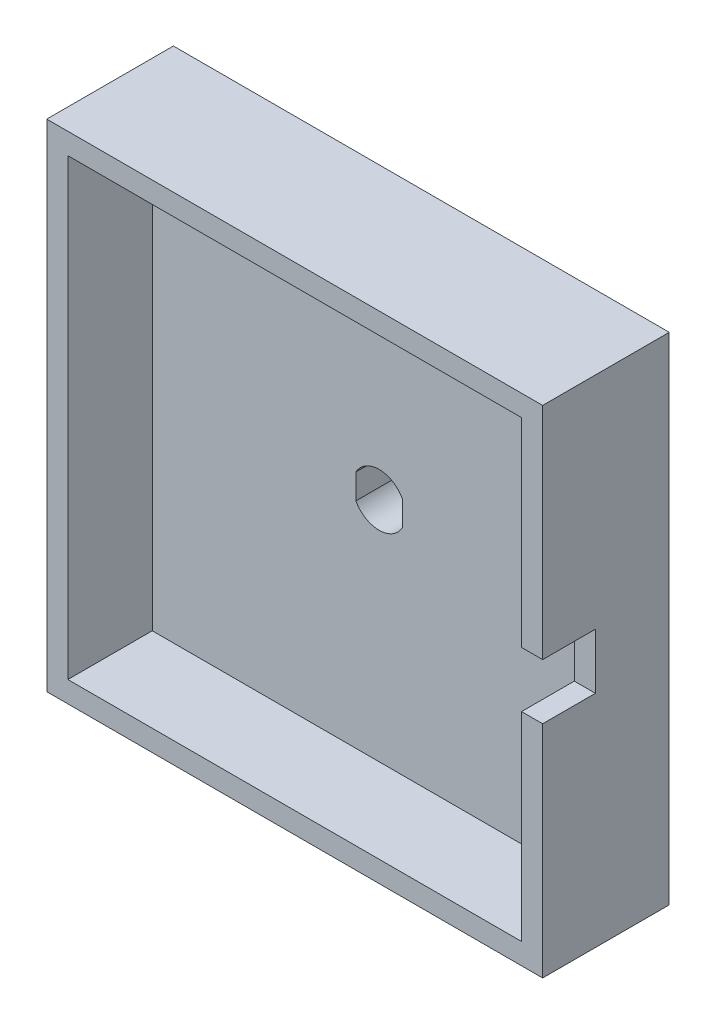
ISO-10303-21;
HEADER;
FILE_DESCRIPTION(('STEP AP214'),'2;1');
FILE_NAME('part.step','',(''),(''),'','','');
FILE_SCHEMA(('AUTOMOTIVE_DESIGN { 1 0 10303 214 1 1 1 1 }'));
ENDSEC;
DATA;
#1=APPLICATION_CONTEXT('core data for automotive mechanical design processes');
#2=APPLICATION_PROTOCOL_DEFINITION('international standard','automotive_design',2000,#1);
#3=PRODUCT_CONTEXT('',#1,'mechanical');
#4=PRODUCT('Part','Part','',(#3));
#5=PRODUCT_RELATED_PRODUCT_CATEGORY('part','',(#4));
#6=PRODUCT_DEFINITION_FORMATION('','',#4);
#7=PRODUCT_DEFINITION_CONTEXT('part definition',#1,'design');
#8=PRODUCT_DEFINITION('design','',#6,#7);
#9=PRODUCT_DEFINITION_SHAPE('','',#8);
#10=(LENGTH_UNIT() NAMED_UNIT(*) SI_UNIT(.MILLI.,.METRE.));
#11=(NAMED_UNIT(*) PLANE_ANGLE_UNIT() SI_UNIT($,.RADIAN.));
#12=(NAMED_UNIT(*) SI_UNIT($,.STERADIAN.) SOLID_ANGLE_UNIT());
#13=UNCERTAINTY_MEASURE_WITH_UNIT(LENGTH_MEASURE(1.E-05),#10,'distance_accuracy_value','');
#14=(GEOMETRIC_REPRESENTATION_CONTEXT(3) GLOBAL_UNCERTAINTY_ASSIGNED_CONTEXT((#13)) GLOBAL_UNIT_ASSIGNED_CONTEXT((#10,
#11,#12)) REPRESENTATION_CONTEXT('',''));
#15=CARTESIAN_POINT('',(0.,0.,0.));
#16=DIRECTION('',(0.,0.,1.));
#17=DIRECTION('',(1.,0.,0.));
#18=AXIS2_PLACEMENT_3D('',#15,#16,#17);
#19=CARTESIAN_POINT('',(0.,0.,4.));
#20=DIRECTION('',(0.,0.,1.));
#21=DIRECTION('',(1.,0.,0.));
#22=AXIS2_PLACEMENT_3D('',#19,#20,#21);
#23=PLANE('',#22);
#24=CARTESIAN_POINT('',(0.,0.,4.));
#25=DIRECTION('',(0.,0.,1.));
#26=DIRECTION('',(1.,0.,0.));
#27=AXIS2_PLACEMENT_3D('',#24,#25,#26);
#28=CIRCLE('',#27,2.5);
#29=CARTESIAN_POINT('',(2.2,1.1874342087038,4.));
#30=VERTEX_POINT('',#29);
#31=CARTESIAN_POINT('',(-2.2,1.1874342087038,4.));
#32=VERTEX_POINT('',#31);
#33=EDGE_CURVE('E42',#30,#32,#28,.T.);
#34=ORIENTED_EDGE('',*,*,#33,.F.);
#35=DIRECTION('',(0.,1.,0.));
#36=VECTOR('',#35,1.);
#37=CARTESIAN_POINT('',(2.2,-1.1874342087038,4.));
#38=LINE('',#37,#36);
#39=CARTESIAN_POINT('',(2.2,-1.1874342087038,4.));
#40=VERTEX_POINT('',#39);
#41=EDGE_CURVE('E313',#40,#30,#38,.T.);
#42=ORIENTED_EDGE('',*,*,#41,.F.);
#43=CARTESIAN_POINT('',(0.,0.,4.));
#44=DIRECTION('',(0.,0.,1.));
#45=DIRECTION('',(1.,0.,0.));
#46=AXIS2_PLACEMENT_3D('',#43,#44,#45);
#47=CIRCLE('',#46,2.5);
#48=CARTESIAN_POINT('',(-2.2,-1.1874342087038,4.));
#49=VERTEX_POINT('',#48);
#50=EDGE_CURVE('E311',#49,#40,#47,.T.);
#51=ORIENTED_EDGE('',*,*,#50,.F.);
#52=DIRECTION('',(0.,1.,0.));
#53=VECTOR('',#52,1.);
#54=CARTESIAN_POINT('',(-2.2,1.1874342087038,4.));
#55=LINE('',#54,#53);
#56=EDGE_CURVE('E279',#32,#49,#55,.F.);
#57=ORIENTED_EDGE('',*,*,#56,.F.);
#58=EDGE_LOOP('',(#34,#42,#51,#57));
#59=FACE_BOUND('',#58,.T.);
#60=CARTESIAN_POINT('',(-17.5,17.5,4.));
#61=DIRECTION('',(0.,0.,1.));
#62=DIRECTION('',(1.,0.,0.));
#63=AXIS2_PLACEMENT_3D('',#60,#61,#62);
#64=CIRCLE('',#63,2.5);
#65=CARTESIAN_POINT('',(-15.,17.5,4.));
#66=VERTEX_POINT('',#65);
#67=EDGE_CURVE('E249',#66,#66,#64,.T.);
#68=ORIENTED_EDGE('',*,*,#67,.F.);
#69=EDGE_LOOP('',(#68));
#70=FACE_BOUND('',#69,.T.);
#71=DIRECTION('',(-1.,0.,0.));
#72=VECTOR('',#71,1.);
#73=CARTESIAN_POINT('',(21.5,21.5,4.));
#74=LINE('',#73,#72);
#75=CARTESIAN_POINT('',(21.5,21.5,4.));
#76=VERTEX_POINT('',#75);
#77=CARTESIAN_POINT('',(-21.5,21.5,4.));
#78=VERTEX_POINT('',#77);
#79=EDGE_CURVE('E190',#76,#78,#74,.T.);
#80=ORIENTED_EDGE('',*,*,#79,.T.);
#81=DIRECTION('',(0.,-1.,0.));
#82=VECTOR('',#81,1.);
#83=CARTESIAN_POINT('',(-21.5,-21.5,4.));
#84=LINE('',#83,#82);
#85=CARTESIAN_POINT('',(-21.5,-21.5,4.));
#86=VERTEX_POINT('',#85);
#87=EDGE_CURVE('E201',#78,#86,#84,.T.);
#88=ORIENTED_EDGE('',*,*,#87,.T.);
#89=DIRECTION('',(1.,0.,0.));
#90=VECTOR('',#89,1.);
#91=CARTESIAN_POINT('',(21.5,-21.5,4.));
#92=LINE('',#91,#90);
#93=CARTESIAN_POINT('',(21.5,-21.5,4.));
#94=VERTEX_POINT('',#93);
#95=EDGE_CURVE('E205',#86,#94,#92,.T.);
#96=ORIENTED_EDGE('',*,*,#95,.T.);
#97=DIRECTION('',(0.,1.,0.));
#98=VECTOR('',#97,1.);
#99=CARTESIAN_POINT('',(21.5,-21.5,4.));
#100=LINE('',#99,#98);
#101=EDGE_CURVE('E210',#94,#76,#100,.T.);
#102=ORIENTED_EDGE('',*,*,#101,.T.);
#103=EDGE_LOOP('',(#80,#88,#96,#102));
#104=FACE_BOUND('',#103,.T.);
#105=ADVANCED_FACE('F38',(#59,#70,#104),#23,.T.);
#106=CARTESIAN_POINT('',(23.5,23.5,4.));
#107=DIRECTION('',(-1.,0.,0.));
#108=DIRECTION('',(0.,-1.,0.));
#109=AXIS2_PLACEMENT_3D('',#106,#107,#108);
#110=PLANE('',#109);
#111=DIRECTION('',(0.,1.,0.));
#112=VECTOR('',#111,1.);
#113=CARTESIAN_POINT('',(23.5,-2.63175946393533,7.));
#114=LINE('',#113,#112);
#115=CARTESIAN_POINT('',(23.5,-2.63175946393533,7.));
#116=VERTEX_POINT('',#115);
#117=CARTESIAN_POINT('',(23.5,2.63175946393533,7.));
#118=VERTEX_POINT('',#117);
#119=EDGE_CURVE('E162',#116,#118,#114,.T.);
#120=ORIENTED_EDGE('',*,*,#119,.F.);
#121=DIRECTION('',(0.,0.,1.));
#122=VECTOR('',#121,1.);
#123=CARTESIAN_POINT('',(23.5,-2.63175946393533,7.));
#124=LINE('',#123,#122);
#125=CARTESIAN_POINT('',(23.5,-2.63175946393533,12.));
#126=VERTEX_POINT('',#125);
#127=EDGE_CURVE('E206',#116,#126,#124,.T.);
#128=ORIENTED_EDGE('',*,*,#127,.T.);
#129=DIRECTION('',(0.,1.,0.));
#130=VECTOR('',#129,1.);
#131=CARTESIAN_POINT('',(23.5,23.5,12.));
#132=LINE('',#131,#130);
#133=CARTESIAN_POINT('',(23.5,-23.5,12.));
#134=VERTEX_POINT('',#133);
#135=EDGE_CURVE('E237',#134,#126,#132,.T.);
#136=ORIENTED_EDGE('',*,*,#135,.F.);
#137=DIRECTION('',(0.,0.,-1.));
#138=VECTOR('',#137,1.);
#139=CARTESIAN_POINT('',(23.5,-23.5,4.));
#140=LINE('',#139,#138);
#141=CARTESIAN_POINT('',(23.5,-23.5,0.));
#142=VERTEX_POINT('',#141);
#143=EDGE_CURVE('E298',#134,#142,#140,.T.);
#144=ORIENTED_EDGE('',*,*,#143,.T.);
#145=DIRECTION('',(0.,1.,0.));
#146=VECTOR('',#145,1.);
#147=CARTESIAN_POINT('',(23.5,23.5,0.));
#148=LINE('',#147,#146);
#149=CARTESIAN_POINT('',(23.5,23.5,0.));
#150=VERTEX_POINT('',#149);
#151=EDGE_CURVE('E285',#142,#150,#148,.T.);
#152=ORIENTED_EDGE('',*,*,#151,.T.);
#153=DIRECTION('',(0.,0.,-1.));
#154=VECTOR('',#153,1.);
#155=CARTESIAN_POINT('',(23.5,23.5,4.));
#156=LINE('',#155,#154);
#157=CARTESIAN_POINT('',(23.5,23.5,12.));
#158=VERTEX_POINT('',#157);
#159=EDGE_CURVE('E11',#158,#150,#156,.T.);
#160=ORIENTED_EDGE('',*,*,#159,.F.);
#161=CARTESIAN_POINT('',(23.5,2.63175946393533,12.));
#162=VERTEX_POINT('',#161);
#163=EDGE_CURVE('E176',#162,#158,#132,.T.);
#164=ORIENTED_EDGE('',*,*,#163,.F.);
#165=DIRECTION('',(0.,0.,1.));
#166=VECTOR('',#165,1.);
#167=CARTESIAN_POINT('',(23.5,2.63175946393533,7.));
#168=LINE('',#167,#166);
#169=EDGE_CURVE('E155',#118,#162,#168,.T.);
#170=ORIENTED_EDGE('',*,*,#169,.F.);
#171=EDGE_LOOP('',(#120,#128,#136,#144,#152,#160,#164,#170));
#172=FACE_BOUND('',#171,.T.);
#173=ADVANCED_FACE('F40',(#172),#110,.F.);
#174=CARTESIAN_POINT('',(-23.5,23.5,4.));
#175=DIRECTION('',(0.,-1.,0.));
#176=DIRECTION('',(0.,0.,-1.));
#177=AXIS2_PLACEMENT_3D('',#174,#175,#176);
#178=PLANE('',#177);
#179=DIRECTION('',(-1.,0.,0.));
#180=VECTOR('',#179,1.);
#181=CARTESIAN_POINT('',(-23.5,23.5,0.));
#182=LINE('',#181,#180);
#183=CARTESIAN_POINT('',(-23.5,23.5,0.));
#184=VERTEX_POINT('',#183);
#185=EDGE_CURVE('E289',#150,#184,#182,.T.);
#186=ORIENTED_EDGE('',*,*,#185,.T.);
#187=DIRECTION('',(0.,0.,-1.));
#188=VECTOR('',#187,1.);
#189=CARTESIAN_POINT('',(-23.5,23.5,4.));
#190=LINE('',#189,#188);
#191=CARTESIAN_POINT('',(-23.5,23.5,12.));
#192=VERTEX_POINT('',#191);
#193=EDGE_CURVE('E48',#192,#184,#190,.T.);
#194=ORIENTED_EDGE('',*,*,#193,.F.);
#195=DIRECTION('',(-1.,0.,0.));
#196=VECTOR('',#195,1.);
#197=CARTESIAN_POINT('',(-23.5,23.5,12.));
#198=LINE('',#197,#196);
#199=EDGE_CURVE('E241',#158,#192,#198,.T.);
#200=ORIENTED_EDGE('',*,*,#199,.F.);
#201=ORIENTED_EDGE('',*,*,#159,.T.);
#202=EDGE_LOOP('',(#186,#194,#200,#201));
#203=FACE_BOUND('',#202,.T.);
#204=ADVANCED_FACE('F353',(#203),#178,.F.);
#205=CARTESIAN_POINT('',(-23.5,23.5,4.));
#206=DIRECTION('',(1.,0.,0.));
#207=DIRECTION('',(0.,1.,0.));
#208=AXIS2_PLACEMENT_3D('',#205,#206,#207);
#209=PLANE('',#208);
#210=DIRECTION('',(0.,-1.,0.));
#211=VECTOR('',#210,1.);
#212=CARTESIAN_POINT('',(-23.5,23.5,0.));
#213=LINE('',#212,#211);
#214=CARTESIAN_POINT('',(-23.5,-23.5,0.));
#215=VERTEX_POINT('',#214);
#216=EDGE_CURVE('E292',#184,#215,#213,.T.);
#217=ORIENTED_EDGE('',*,*,#216,.T.);
#218=DIRECTION('',(0.,0.,-1.));
#219=VECTOR('',#218,1.);
#220=CARTESIAN_POINT('',(-23.5,-23.5,4.));
#221=LINE('',#220,#219);
#222=CARTESIAN_POINT('',(-23.5,-23.5,12.));
#223=VERTEX_POINT('',#222);
#224=EDGE_CURVE('E302',#223,#215,#221,.T.);
#225=ORIENTED_EDGE('',*,*,#224,.F.);
#226=DIRECTION('',(0.,-1.,0.));
#227=VECTOR('',#226,1.);
#228=CARTESIAN_POINT('',(-23.5,23.5,12.));
#229=LINE('',#228,#227);
#230=EDGE_CURVE('E229',#192,#223,#229,.T.);
#231=ORIENTED_EDGE('',*,*,#230,.F.);
#232=ORIENTED_EDGE('',*,*,#193,.T.);
#233=EDGE_LOOP('',(#217,#225,#231,#232));
#234=FACE_BOUND('',#233,.T.);
#235=ADVANCED_FACE('F362',(#234),#209,.F.);
#236=CARTESIAN_POINT('',(-23.5,-23.5,4.));
#237=DIRECTION('',(0.,1.,0.));
#238=DIRECTION('',(0.,0.,1.));
#239=AXIS2_PLACEMENT_3D('',#236,#237,#238);
#240=PLANE('',#239);
#241=DIRECTION('',(1.,0.,0.));
#242=VECTOR('',#241,1.);
#243=CARTESIAN_POINT('',(-23.5,-23.5,0.));
#244=LINE('',#243,#242);
#245=EDGE_CURVE('E295',#215,#142,#244,.T.);
#246=ORIENTED_EDGE('',*,*,#245,.T.);
#247=ORIENTED_EDGE('',*,*,#143,.F.);
#248=DIRECTION('',(1.,0.,0.));
#249=VECTOR('',#248,1.);
#250=CARTESIAN_POINT('',(-23.5,-23.5,12.));
#251=LINE('',#250,#249);
#252=EDGE_CURVE('E233',#223,#134,#251,.T.);
#253=ORIENTED_EDGE('',*,*,#252,.F.);
#254=ORIENTED_EDGE('',*,*,#224,.T.);
#255=EDGE_LOOP('',(#246,#247,#253,#254));
#256=FACE_BOUND('',#255,.T.);
#257=ADVANCED_FACE('F358',(#256),#240,.F.);
#258=CARTESIAN_POINT('',(0.,0.,0.));
#259=DIRECTION('',(0.,0.,1.));
#260=DIRECTION('',(1.,0.,0.));
#261=AXIS2_PLACEMENT_3D('',#258,#259,#260);
#262=PLANE('',#261);
#263=CARTESIAN_POINT('',(-17.5,17.5,0.));
#264=DIRECTION('',(0.,0.,1.));
#265=DIRECTION('',(1.,0.,0.));
#266=AXIS2_PLACEMENT_3D('',#263,#264,#265);
#267=CIRCLE('',#266,2.5);
#268=CARTESIAN_POINT('',(-15.,17.5,0.));
#269=VERTEX_POINT('',#268);
#270=EDGE_CURVE('E245',#269,#269,#267,.T.);
#271=ORIENTED_EDGE('',*,*,#270,.T.);
#272=EDGE_LOOP('',(#271));
#273=FACE_BOUND('',#272,.T.);
#274=DIRECTION('',(0.,1.,0.));
#275=VECTOR('',#274,1.);
#276=CARTESIAN_POINT('',(2.2,-1.1874342087038,0.));
#277=LINE('',#276,#275);
#278=CARTESIAN_POINT('',(2.2,-1.1874342087038,0.));
#279=VERTEX_POINT('',#278);
#280=CARTESIAN_POINT('',(2.2,1.1874342087038,0.));
#281=VERTEX_POINT('',#280);
#282=EDGE_CURVE('E265',#279,#281,#277,.T.);
#283=ORIENTED_EDGE('',*,*,#282,.T.);
#284=CARTESIAN_POINT('',(0.,0.,0.));
#285=DIRECTION('',(0.,0.,1.));
#286=DIRECTION('',(1.,0.,0.));
#287=AXIS2_PLACEMENT_3D('',#284,#285,#286);
#288=CIRCLE('',#287,2.5);
#289=CARTESIAN_POINT('',(-2.2,1.1874342087038,0.));
#290=VERTEX_POINT('',#289);
#291=EDGE_CURVE('E253',#281,#290,#288,.T.);
#292=ORIENTED_EDGE('',*,*,#291,.T.);
#293=DIRECTION('',(0.,-1.,0.));
#294=VECTOR('',#293,1.);
#295=CARTESIAN_POINT('',(-2.2,1.1874342087038,0.));
#296=LINE('',#295,#294);
#297=CARTESIAN_POINT('',(-2.2,-1.1874342087038,0.));
#298=VERTEX_POINT('',#297);
#299=EDGE_CURVE('E257',#290,#298,#296,.T.);
#300=ORIENTED_EDGE('',*,*,#299,.T.);
#301=CARTESIAN_POINT('',(0.,0.,0.));
#302=DIRECTION('',(0.,0.,1.));
#303=DIRECTION('',(1.,0.,0.));
#304=AXIS2_PLACEMENT_3D('',#301,#302,#303);
#305=CIRCLE('',#304,2.5);
#306=EDGE_CURVE('E261',#298,#279,#305,.T.);
#307=ORIENTED_EDGE('',*,*,#306,.T.);
#308=EDGE_LOOP('',(#283,#292,#300,#307));
#309=FACE_BOUND('',#308,.T.);
#310=ORIENTED_EDGE('',*,*,#151,.F.);
#311=ORIENTED_EDGE('',*,*,#245,.F.);
#312=ORIENTED_EDGE('',*,*,#216,.F.);
#313=ORIENTED_EDGE('',*,*,#185,.F.);
#314=EDGE_LOOP('',(#310,#311,#312,#313));
#315=FACE_BOUND('',#314,.T.);
#316=ADVANCED_FACE('F335',(#273,#309,#315),#262,.F.);
#317=CARTESIAN_POINT('',(0.,0.,0.));
#318=DIRECTION('',(0.,0.,1.));
#319=DIRECTION('',(1.,0.,0.));
#320=AXIS2_PLACEMENT_3D('',#317,#318,#319);
#321=CYLINDRICAL_SURFACE('',#320,2.5);
#322=ORIENTED_EDGE('',*,*,#33,.T.);
#323=DIRECTION('',(0.,0.,1.));
#324=VECTOR('',#323,1.);
#325=CARTESIAN_POINT('',(-2.2,1.1874342087038,0.));
#326=LINE('',#325,#324);
#327=EDGE_CURVE('E269',#290,#32,#326,.T.);
#328=ORIENTED_EDGE('',*,*,#327,.F.);
#329=ORIENTED_EDGE('',*,*,#291,.F.);
#330=DIRECTION('',(0.,0.,1.));
#331=VECTOR('',#330,1.);
#332=CARTESIAN_POINT('',(2.2,1.1874342087038,0.));
#333=LINE('',#332,#331);
#334=EDGE_CURVE('E274',#281,#30,#333,.T.);
#335=ORIENTED_EDGE('',*,*,#334,.T.);
#336=EDGE_LOOP('',(#322,#328,#329,#335));
#337=FACE_BOUND('',#336,.T.);
#338=ADVANCED_FACE('F322',(#337),#321,.F.);
#339=CARTESIAN_POINT('',(2.2,-1.1874342087038,0.));
#340=DIRECTION('',(1.,0.,0.));
#341=DIRECTION('',(0.,0.,-1.));
#342=AXIS2_PLACEMENT_3D('',#339,#340,#341);
#343=PLANE('',#342);
#344=ORIENTED_EDGE('',*,*,#41,.T.);
#345=ORIENTED_EDGE('',*,*,#334,.F.);
#346=ORIENTED_EDGE('',*,*,#282,.F.);
#347=DIRECTION('',(0.,0.,1.));
#348=VECTOR('',#347,1.);
#349=CARTESIAN_POINT('',(2.2,-1.1874342087038,0.));
#350=LINE('',#349,#348);
#351=EDGE_CURVE('E270',#279,#40,#350,.T.);
#352=ORIENTED_EDGE('',*,*,#351,.T.);
#353=EDGE_LOOP('',(#344,#345,#346,#352));
#354=FACE_BOUND('',#353,.T.);
#355=ADVANCED_FACE('F337',(#354),#343,.F.);
#356=CARTESIAN_POINT('',(0.,0.,0.));
#357=DIRECTION('',(0.,0.,1.));
#358=DIRECTION('',(1.,0.,0.));
#359=AXIS2_PLACEMENT_3D('',#356,#357,#358);
#360=CYLINDRICAL_SURFACE('',#359,2.5);
#361=ORIENTED_EDGE('',*,*,#50,.T.);
#362=ORIENTED_EDGE('',*,*,#351,.F.);
#363=ORIENTED_EDGE('',*,*,#306,.F.);
#364=DIRECTION('',(0.,0.,1.));
#365=VECTOR('',#364,1.);
#366=CARTESIAN_POINT('',(-2.2,-1.1874342087038,0.));
#367=LINE('',#366,#365);
#368=EDGE_CURVE('E275',#298,#49,#367,.T.);
#369=ORIENTED_EDGE('',*,*,#368,.T.);
#370=EDGE_LOOP('',(#361,#362,#363,#369));
#371=FACE_BOUND('',#370,.T.);
#372=ADVANCED_FACE('F332',(#371),#360,.F.);
#373=CARTESIAN_POINT('',(-2.2,1.1874342087038,0.));
#374=DIRECTION('',(-1.,0.,0.));
#375=DIRECTION('',(0.,0.,1.));
#376=AXIS2_PLACEMENT_3D('',#373,#374,#375);
#377=PLANE('',#376);
#378=ORIENTED_EDGE('',*,*,#56,.T.);
#379=ORIENTED_EDGE('',*,*,#368,.F.);
#380=ORIENTED_EDGE('',*,*,#299,.F.);
#381=ORIENTED_EDGE('',*,*,#327,.T.);
#382=EDGE_LOOP('',(#378,#379,#380,#381));
#383=FACE_BOUND('',#382,.T.);
#384=ADVANCED_FACE('F330',(#383),#377,.F.);
#385=CARTESIAN_POINT('',(-17.5,17.5,0.));
#386=DIRECTION('',(0.,0.,1.));
#387=DIRECTION('',(1.,0.,0.));
#388=AXIS2_PLACEMENT_3D('',#385,#386,#387);
#389=CYLINDRICAL_SURFACE('',#388,2.5);
#390=ORIENTED_EDGE('',*,*,#67,.T.);
#391=EDGE_LOOP('',(#390));
#392=FACE_BOUND('',#391,.T.);
#393=ORIENTED_EDGE('',*,*,#270,.F.);
#394=EDGE_LOOP('',(#393));
#395=FACE_BOUND('',#394,.T.);
#396=ADVANCED_FACE('F428',(#392,#395),#389,.F.);
#397=CARTESIAN_POINT('',(0.,0.,12.));
#398=DIRECTION('',(0.,0.,1.));
#399=DIRECTION('',(1.,0.,0.));
#400=AXIS2_PLACEMENT_3D('',#397,#398,#399);
#401=PLANE('',#400);
#402=DIRECTION('',(1.,0.,0.));
#403=VECTOR('',#402,1.);
#404=CARTESIAN_POINT('',(21.5,-2.63175946393533,12.));
#405=LINE('',#404,#403);
#406=CARTESIAN_POINT('',(21.5,-2.63175946393533,12.));
#407=VERTEX_POINT('',#406);
#408=EDGE_CURVE('E172',#407,#126,#405,.T.);
#409=ORIENTED_EDGE('',*,*,#408,.F.);
#410=DIRECTION('',(0.,1.,0.));
#411=VECTOR('',#410,1.);
#412=CARTESIAN_POINT('',(21.5,-21.5,12.));
#413=LINE('',#412,#411);
#414=CARTESIAN_POINT('',(21.5,-21.5,12.));
#415=VERTEX_POINT('',#414);
#416=EDGE_CURVE('E194',#415,#407,#413,.T.);
#417=ORIENTED_EDGE('',*,*,#416,.F.);
#418=DIRECTION('',(1.,0.,0.));
#419=VECTOR('',#418,1.);
#420=CARTESIAN_POINT('',(21.5,-21.5,12.));
#421=LINE('',#420,#419);
#422=CARTESIAN_POINT('',(-21.5,-21.5,12.));
#423=VERTEX_POINT('',#422);
#424=EDGE_CURVE('E189',#423,#415,#421,.T.);
#425=ORIENTED_EDGE('',*,*,#424,.F.);
#426=DIRECTION('',(0.,-1.,0.));
#427=VECTOR('',#426,1.);
#428=CARTESIAN_POINT('',(-21.5,-21.5,12.));
#429=LINE('',#428,#427);
#430=CARTESIAN_POINT('',(-21.5,21.5,12.));
#431=VERTEX_POINT('',#430);
#432=EDGE_CURVE('E186',#431,#423,#429,.T.);
#433=ORIENTED_EDGE('',*,*,#432,.F.);
#434=DIRECTION('',(-1.,0.,0.));
#435=VECTOR('',#434,1.);
#436=CARTESIAN_POINT('',(21.5,21.5,12.));
#437=LINE('',#436,#435);
#438=CARTESIAN_POINT('',(21.5,21.5,12.));
#439=VERTEX_POINT('',#438);
#440=EDGE_CURVE('E198',#439,#431,#437,.T.);
#441=ORIENTED_EDGE('',*,*,#440,.F.);
#442=CARTESIAN_POINT('',(21.5,2.63175946393533,12.));
#443=VERTEX_POINT('',#442);
#444=EDGE_CURVE('E193',#443,#439,#413,.T.);
#445=ORIENTED_EDGE('',*,*,#444,.F.);
#446=DIRECTION('',(-1.,0.,0.));
#447=VECTOR('',#446,1.);
#448=CARTESIAN_POINT('',(21.5,2.63175946393533,12.));
#449=LINE('',#448,#447);
#450=EDGE_CURVE('E382',#162,#443,#449,.T.);
#451=ORIENTED_EDGE('',*,*,#450,.F.);
#452=ORIENTED_EDGE('',*,*,#163,.T.);
#453=ORIENTED_EDGE('',*,*,#199,.T.);
#454=ORIENTED_EDGE('',*,*,#230,.T.);
#455=ORIENTED_EDGE('',*,*,#252,.T.);
#456=ORIENTED_EDGE('',*,*,#135,.T.);
#457=EDGE_LOOP('',(#409,#417,#425,#433,#441,#445,#451,#452,#453,#454,#455,#456));
#458=FACE_BOUND('',#457,.T.);
#459=ADVANCED_FACE('F379',(#458),#401,.T.);
#460=CARTESIAN_POINT('',(-21.5,-21.5,12.));
#461=DIRECTION('',(1.,0.,0.));
#462=DIRECTION('',(0.,0.,-1.));
#463=AXIS2_PLACEMENT_3D('',#460,#461,#462);
#464=PLANE('',#463);
#465=ORIENTED_EDGE('',*,*,#87,.F.);
#466=DIRECTION('',(0.,0.,-1.));
#467=VECTOR('',#466,1.);
#468=CARTESIAN_POINT('',(-21.5,21.5,12.));
#469=LINE('',#468,#467);
#470=EDGE_CURVE('E64',#431,#78,#469,.T.);
#471=ORIENTED_EDGE('',*,*,#470,.F.);
#472=ORIENTED_EDGE('',*,*,#432,.T.);
#473=DIRECTION('',(0.,0.,-1.));
#474=VECTOR('',#473,1.);
#475=CARTESIAN_POINT('',(-21.5,-21.5,12.));
#476=LINE('',#475,#474);
#477=EDGE_CURVE('E225',#423,#86,#476,.T.);
#478=ORIENTED_EDGE('',*,*,#477,.T.);
#479=EDGE_LOOP('',(#465,#471,#472,#478));
#480=FACE_BOUND('',#479,.T.);
#481=ADVANCED_FACE('F408',(#480),#464,.T.);
#482=CARTESIAN_POINT('',(21.5,-21.5,12.));
#483=DIRECTION('',(0.,1.,0.));
#484=DIRECTION('',(0.,0.,1.));
#485=AXIS2_PLACEMENT_3D('',#482,#483,#484);
#486=PLANE('',#485);
#487=ORIENTED_EDGE('',*,*,#95,.F.);
#488=ORIENTED_EDGE('',*,*,#477,.F.);
#489=ORIENTED_EDGE('',*,*,#424,.T.);
#490=DIRECTION('',(0.,0.,-1.));
#491=VECTOR('',#490,1.);
#492=CARTESIAN_POINT('',(21.5,-21.5,12.));
#493=LINE('',#492,#491);
#494=EDGE_CURVE('E222',#415,#94,#493,.T.);
#495=ORIENTED_EDGE('',*,*,#494,.T.);
#496=EDGE_LOOP('',(#487,#488,#489,#495));
#497=FACE_BOUND('',#496,.T.);
#498=ADVANCED_FACE('F406',(#497),#486,.T.);
#499=CARTESIAN_POINT('',(21.5,-21.5,12.));
#500=DIRECTION('',(-1.,0.,0.));
#501=DIRECTION('',(0.,0.,1.));
#502=AXIS2_PLACEMENT_3D('',#499,#500,#501);
#503=PLANE('',#502);
#504=DIRECTION('',(0.,0.,1.));
#505=VECTOR('',#504,1.);
#506=CARTESIAN_POINT('',(21.5,-2.63175946393533,7.));
#507=LINE('',#506,#505);
#508=CARTESIAN_POINT('',(21.5,-2.63175946393533,7.));
#509=VERTEX_POINT('',#508);
#510=EDGE_CURVE('E181',#509,#407,#507,.T.);
#511=ORIENTED_EDGE('',*,*,#510,.F.);
#512=DIRECTION('',(0.,-1.,0.));
#513=VECTOR('',#512,1.);
#514=CARTESIAN_POINT('',(21.5,-2.63175946393533,7.));
#515=LINE('',#514,#513);
#516=CARTESIAN_POINT('',(21.5,2.63175946393533,7.));
#517=VERTEX_POINT('',#516);
#518=EDGE_CURVE('E161',#517,#509,#515,.T.);
#519=ORIENTED_EDGE('',*,*,#518,.F.);
#520=DIRECTION('',(0.,0.,1.));
#521=VECTOR('',#520,1.);
#522=CARTESIAN_POINT('',(21.5,2.63175946393533,7.));
#523=LINE('',#522,#521);
#524=EDGE_CURVE('E158',#517,#443,#523,.T.);
#525=ORIENTED_EDGE('',*,*,#524,.T.);
#526=ORIENTED_EDGE('',*,*,#444,.T.);
#527=DIRECTION('',(0.,0.,-1.));
#528=VECTOR('',#527,1.);
#529=CARTESIAN_POINT('',(21.5,21.5,12.));
#530=LINE('',#529,#528);
#531=EDGE_CURVE('E219',#439,#76,#530,.T.);
#532=ORIENTED_EDGE('',*,*,#531,.T.);
#533=ORIENTED_EDGE('',*,*,#101,.F.);
#534=ORIENTED_EDGE('',*,*,#494,.F.);
#535=ORIENTED_EDGE('',*,*,#416,.T.);
#536=EDGE_LOOP('',(#511,#519,#525,#526,#532,#533,#534,#535));
#537=FACE_BOUND('',#536,.T.);
#538=ADVANCED_FACE('F398',(#537),#503,.T.);
#539=CARTESIAN_POINT('',(21.5,21.5,12.));
#540=DIRECTION('',(0.,-1.,0.));
#541=DIRECTION('',(0.,0.,-1.));
#542=AXIS2_PLACEMENT_3D('',#539,#540,#541);
#543=PLANE('',#542);
#544=ORIENTED_EDGE('',*,*,#79,.F.);
#545=ORIENTED_EDGE('',*,*,#531,.F.);
#546=ORIENTED_EDGE('',*,*,#440,.T.);
#547=ORIENTED_EDGE('',*,*,#470,.T.);
#548=EDGE_LOOP('',(#544,#545,#546,#547));
#549=FACE_BOUND('',#548,.T.);
#550=ADVANCED_FACE('F411',(#549),#543,.T.);
#551=CARTESIAN_POINT('',(21.5,-2.63175946393533,7.));
#552=DIRECTION('',(0.,-1.,0.));
#553=DIRECTION('',(0.,0.,-1.));
#554=AXIS2_PLACEMENT_3D('',#551,#552,#553);
#555=PLANE('',#554);
#556=ORIENTED_EDGE('',*,*,#408,.T.);
#557=ORIENTED_EDGE('',*,*,#127,.F.);
#558=DIRECTION('',(1.,0.,0.));
#559=VECTOR('',#558,1.);
#560=CARTESIAN_POINT('',(21.5,-2.63175946393533,7.));
#561=LINE('',#560,#559);
#562=EDGE_CURVE('E168',#509,#116,#561,.T.);
#563=ORIENTED_EDGE('',*,*,#562,.F.);
#564=ORIENTED_EDGE('',*,*,#510,.T.);
#565=EDGE_LOOP('',(#556,#557,#563,#564));
#566=FACE_BOUND('',#565,.T.);
#567=ADVANCED_FACE('F397',(#566),#555,.F.);
#568=CARTESIAN_POINT('',(21.5,2.63175946393533,7.));
#569=DIRECTION('',(0.,1.,0.));
#570=DIRECTION('',(0.,0.,1.));
#571=AXIS2_PLACEMENT_3D('',#568,#569,#570);
#572=PLANE('',#571);
#573=ORIENTED_EDGE('',*,*,#450,.T.);
#574=ORIENTED_EDGE('',*,*,#524,.F.);
#575=DIRECTION('',(-1.,0.,0.));
#576=VECTOR('',#575,1.);
#577=CARTESIAN_POINT('',(21.5,2.63175946393533,7.));
#578=LINE('',#577,#576);
#579=EDGE_CURVE('E56',#118,#517,#578,.T.);
#580=ORIENTED_EDGE('',*,*,#579,.F.);
#581=ORIENTED_EDGE('',*,*,#169,.T.);
#582=EDGE_LOOP('',(#573,#574,#580,#581));
#583=FACE_BOUND('',#582,.T.);
#584=ADVANCED_FACE('F153',(#583),#572,.F.);
#585=CARTESIAN_POINT('',(0.,0.,7.));
#586=DIRECTION('',(0.,0.,-1.));
#587=DIRECTION('',(-1.,0.,0.));
#588=AXIS2_PLACEMENT_3D('',#585,#586,#587);
#589=PLANE('',#588);
#590=ORIENTED_EDGE('',*,*,#119,.T.);
#591=ORIENTED_EDGE('',*,*,#579,.T.);
#592=ORIENTED_EDGE('',*,*,#518,.T.);
#593=ORIENTED_EDGE('',*,*,#562,.T.);
#594=EDGE_LOOP('',(#590,#591,#592,#593));
#595=FACE_BOUND('',#594,.T.);
#596=ADVANCED_FACE('F166',(#595),#589,.F.);
#597=CLOSED_SHELL('',(#105,#173,#204,#235,#257,#316,#338,#355,#372,#384,#396,#459,#481,#498,
#538,#550,#567,#584,#596));
#598=MANIFOLD_SOLID_BREP('B2',#597);
#599=ADVANCED_BREP_SHAPE_REPRESENTATION('',(#18,#598),#14);
#600=SHAPE_DEFINITION_REPRESENTATION(#9,#599);
ENDSEC;
END-ISO-10303-21;
